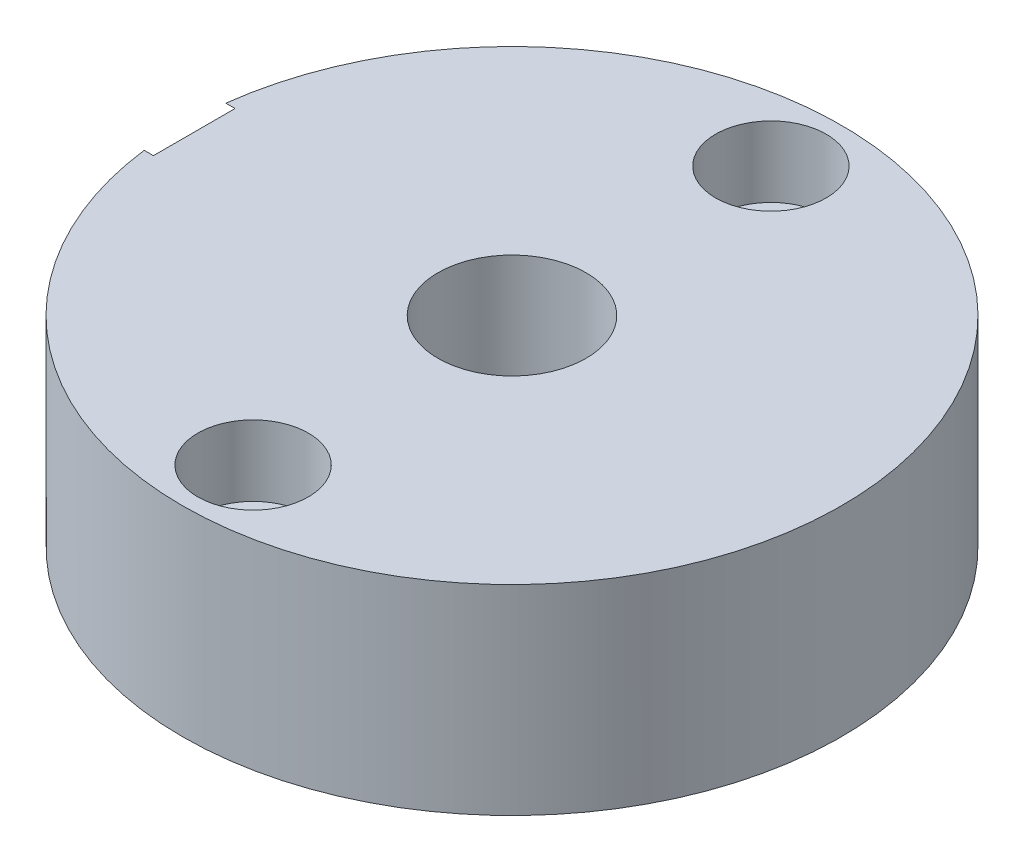
ISO-10303-21;
HEADER;
FILE_DESCRIPTION(('STEP AP214'),'2;1');
FILE_NAME('part.step','',(''),(''),'','','');
FILE_SCHEMA(('AUTOMOTIVE_DESIGN { 1 0 10303 214 1 1 1 1 }'));
ENDSEC;
DATA;
#1=APPLICATION_CONTEXT('core data for automotive mechanical design processes');
#2=APPLICATION_PROTOCOL_DEFINITION('international standard','automotive_design',2000,#1);
#3=PRODUCT_CONTEXT('',#1,'mechanical');
#4=PRODUCT('Part','Part','',(#3));
#5=PRODUCT_RELATED_PRODUCT_CATEGORY('part','',(#4));
#6=PRODUCT_DEFINITION_FORMATION('','',#4);
#7=PRODUCT_DEFINITION_CONTEXT('part definition',#1,'design');
#8=PRODUCT_DEFINITION('design','',#6,#7);
#9=PRODUCT_DEFINITION_SHAPE('','',#8);
#10=(LENGTH_UNIT() NAMED_UNIT(*) SI_UNIT(.MILLI.,.METRE.));
#11=(NAMED_UNIT(*) PLANE_ANGLE_UNIT() SI_UNIT($,.RADIAN.));
#12=(NAMED_UNIT(*) SI_UNIT($,.STERADIAN.) SOLID_ANGLE_UNIT());
#13=UNCERTAINTY_MEASURE_WITH_UNIT(LENGTH_MEASURE(1.E-05),#10,'distance_accuracy_value','');
#14=(GEOMETRIC_REPRESENTATION_CONTEXT(3) GLOBAL_UNCERTAINTY_ASSIGNED_CONTEXT((#13)) GLOBAL_UNIT_ASSIGNED_CONTEXT((#10,
#11,#12)) REPRESENTATION_CONTEXT('',''));
#15=CARTESIAN_POINT('',(0.,0.,0.));
#16=DIRECTION('',(0.,0.,1.));
#17=DIRECTION('',(1.,0.,0.));
#18=AXIS2_PLACEMENT_3D('',#15,#16,#17);
#19=CARTESIAN_POINT('',(0.,0.,0.));
#20=DIRECTION('',(0.,1.,0.));
#21=DIRECTION('',(0.,0.,1.));
#22=AXIS2_PLACEMENT_3D('',#19,#20,#21);
#23=CYLINDRICAL_SURFACE('',#22,14.224);
#24=CARTESIAN_POINT('',(-14.1144017031364,8.636,-1.76233951396999));
#25=CARTESIAN_POINT('',(-14.1018189708603,8.5860400774121,-1.86316944306617));
#26=CARTESIAN_POINT('',(-14.0884029510449,8.53182037336474,-1.96177374774942));
#27=CARTESIAN_POINT('',(-14.060309209815,8.41531440898184,-2.15389238319063));
#28=CARTESIAN_POINT('',(-14.0456316331366,8.35302907358731,-2.24740729584016));
#29=CARTESIAN_POINT('',(-14.0153964032384,8.22074490813978,-2.42885291939024));
#30=CARTESIAN_POINT('',(-13.9998376006231,8.15073588572585,-2.51677600419321));
#31=CARTESIAN_POINT('',(-13.9682944020645,8.00356223569752,-2.68632848078117));
#32=CARTESIAN_POINT('',(-13.9523100128641,7.92639772140656,-2.76795797220202));
#33=CARTESIAN_POINT('',(-13.9203573702186,7.76540029526525,-2.92441560607991));
#34=CARTESIAN_POINT('',(-13.9043891243674,7.68156506176776,-2.99924136100932));
#35=CARTESIAN_POINT('',(-13.8729273525824,7.50779999847033,-3.1415560905345));
#36=CARTESIAN_POINT('',(-13.8574338186305,7.41787027169462,-3.20904518910241));
#37=CARTESIAN_POINT('',(-13.8273998231862,7.23269940985755,-3.33608202397885));
#38=CARTESIAN_POINT('',(-13.8128574379487,7.1374697652673,-3.39564605863353));
#39=CARTESIAN_POINT('',(-13.7851236400461,6.94219371995553,-3.50653797394215));
#40=CARTESIAN_POINT('',(-13.7719315387029,6.84214981329113,-3.55787006074027));
#41=CARTESIAN_POINT('',(-13.7515217306795,6.67297933704027,-3.63577308768279));
#42=CARTESIAN_POINT('',(-13.7438077843705,6.60502971023918,-3.66479473624717));
#43=CARTESIAN_POINT('',(-13.7292386448564,6.46761208866137,-3.71899995238225));
#44=CARTESIAN_POINT('',(-13.7223825366595,6.39814580613028,-3.74418761569942));
#45=CARTESIAN_POINT('',(-13.716,6.3279809944466,-3.7674288314446));
#46=B_SPLINE_CURVE_WITH_KNOTS('',3,(#24,#25,#26,#27,#28,#29,#30,#31,#32,#33,#34,#35,#36,#37,#38,
#39,#40,#41,#42,#43,#44,#45),.UNSPECIFIED.,.F.,.F.,(4,2,2,2,2,2,2,2,2,2,4),(0.,
0.339571560025639,0.679104213490783,1.01909040632158,1.35907121561906,1.6991708722571,
2.0392647811214,2.37864808472907,2.71785742283711,2.94061439026513,3.1631316964547),.UNSPECIFIED.);
#47=CARTESIAN_POINT('',(-14.1144017031364,8.636,-1.76233951396999));
#48=VERTEX_POINT('',#47);
#49=CARTESIAN_POINT('',(-13.716,6.3279809944466,-3.7674288314446));
#50=VERTEX_POINT('',#49);
#51=EDGE_CURVE('E189',#48,#50,#46,.T.);
#52=ORIENTED_EDGE('',*,*,#51,.F.);
#53=CARTESIAN_POINT('',(0.,8.636,0.));
#54=DIRECTION('',(0.,1.,0.));
#55=DIRECTION('',(0.,0.,1.));
#56=AXIS2_PLACEMENT_3D('',#53,#54,#55);
#57=CIRCLE('',#56,14.224);
#58=CARTESIAN_POINT('',(-14.1144017031364,8.636,1.76233951396999));
#59=VERTEX_POINT('',#58);
#60=EDGE_CURVE('E158',#59,#48,#57,.T.);
#61=ORIENTED_EDGE('',*,*,#60,.F.);
#62=CARTESIAN_POINT('',(-13.716,6.32798099444662,3.7674288314446));
#63=CARTESIAN_POINT('',(-13.7256752274223,6.43441671403951,3.73218226606413));
#64=CARTESIAN_POINT('',(-13.7364511952819,6.5392480193785,3.69244070180806));
#65=CARTESIAN_POINT('',(-13.7598334716294,6.74499152616562,3.60434170694817));
#66=CARTESIAN_POINT('',(-13.7724394284483,6.84590447589213,3.55598593133243));
#67=CARTESIAN_POINT('',(-13.7991212477723,7.04319198204466,3.45099243760769));
#68=CARTESIAN_POINT('',(-13.8131978464105,7.1395642302546,3.39435056614256));
#69=CARTESIAN_POINT('',(-13.8423953365519,7.32706281981836,3.27324792969377));
#70=CARTESIAN_POINT('',(-13.8575162318728,7.41818914199239,3.2087871361258));
#71=CARTESIAN_POINT('',(-13.9037966552396,7.68277980250731,3.00434946030897));
#72=CARTESIAN_POINT('',(-13.9359009480219,7.8476460188197,2.85321568473428));
#73=CARTESIAN_POINT('',(-13.9989711835599,8.14950079732574,2.525596782463));
#74=CARTESIAN_POINT('',(-14.0299392423452,8.28654358683355,2.34916213506834));
#75=CARTESIAN_POINT('',(-14.0685657406809,8.44971584425602,2.09807351538581));
#76=CARTESIAN_POINT('',(-14.0782051283558,8.489695649873,2.03245392920464));
#77=CARTESIAN_POINT('',(-14.0968231765953,8.56576823735887,1.89901959457042));
#78=CARTESIAN_POINT('',(-14.1058026527453,8.6018658437257,1.83120771016513));
#79=CARTESIAN_POINT('',(-14.1144017031364,8.636,1.76233951396999));
#80=B_SPLINE_CURVE_WITH_KNOTS('',3,(#62,#63,#64,#65,#66,#67,#68,#69,#70,#71,#72,#73,#74,#75,#76,
#77,#78,#79),.UNSPECIFIED.,.F.,.F.,(4,2,2,2,2,2,2,2,4),(0.,0.337481169142765,0.674897570182395,
1.01248368238958,1.35007102877738,2.02460201647477,2.69780546224259,2.93003018694968,
3.16196290219643),.UNSPECIFIED.);
#81=CARTESIAN_POINT('',(-13.716,6.32798099444662,3.7674288314446));
#82=VERTEX_POINT('',#81);
#83=EDGE_CURVE('E57',#82,#59,#80,.T.);
#84=ORIENTED_EDGE('',*,*,#83,.F.);
#85=DIRECTION('',(0.,1.,0.));
#86=VECTOR('',#85,1.);
#87=CARTESIAN_POINT('',(-13.716,0.,3.7674288314446));
#88=LINE('',#87,#86);
#89=CARTESIAN_POINT('',(-13.716,3.83201900555338,3.7674288314446));
#90=VERTEX_POINT('',#89);
#91=EDGE_CURVE('E170',#90,#82,#88,.T.);
#92=ORIENTED_EDGE('',*,*,#91,.F.);
#93=CARTESIAN_POINT('',(-13.716,3.8320190055534,-3.7674288314446));
#94=CARTESIAN_POINT('',(-13.7256832030554,3.72549547487357,-3.73215300898994));
#95=CARTESIAN_POINT('',(-13.7364689511062,3.62057917763459,-3.69237510692438));
#96=CARTESIAN_POINT('',(-13.7598730650016,3.41467658831599,-3.60419119044807));
#97=CARTESIAN_POINT('',(-13.7724910095912,3.3136893996123,-3.55578715876054));
#98=CARTESIAN_POINT('',(-13.7991770735619,3.11642010455883,-3.45076856800852));
#99=CARTESIAN_POINT('',(-13.8132435746677,3.0201329211109,-3.39416314307337));
#100=CARTESIAN_POINT('',(-13.8424190011879,2.83279443524339,-3.27314752117977));
#101=CARTESIAN_POINT('',(-13.8575279696299,2.74174334922734,-3.20873700198464));
#102=CARTESIAN_POINT('',(-13.9037657698442,2.4773975772599,-3.00448246486439));
#103=CARTESIAN_POINT('',(-13.9358393240575,2.31267237301909,-2.85348831252477));
#104=CARTESIAN_POINT('',(-13.9989028009506,2.01080298829319,-2.52599924707586));
#105=CARTESIAN_POINT('',(-14.0298926315931,1.87366114569923,-2.3495021745848));
#106=CARTESIAN_POINT('',(-14.0877428513713,1.62926520659395,-1.97337670408356));
#107=CARTESIAN_POINT('',(-14.1145538216584,1.52235814638346,-1.77351423734908));
#108=CARTESIAN_POINT('',(-14.1605904232901,1.34387846931438,-1.35776696177541));
#109=CARTESIAN_POINT('',(-14.1798170716613,1.27230111456323,-1.14188430579399));
#110=CARTESIAN_POINT('',(-14.208102650291,1.16829544419417,-0.706019846943991));
#111=CARTESIAN_POINT('',(-14.2174060804188,1.13492416082455,-0.486279224026567));
#112=CARTESIAN_POINT('',(-14.2256485600171,1.10531829732902,-0.0441420578764475));
#113=CARTESIAN_POINT('',(-14.2245897983837,1.10907587415198,0.178253914530367));
#114=CARTESIAN_POINT('',(-14.2124057676836,1.15295471256416,0.612960969777735));
#115=CARTESIAN_POINT('',(-14.2015564223421,1.19207929289632,0.82538155554918));
#116=CARTESIAN_POINT('',(-14.1713318873773,1.30397960109528,1.24051122348173));
#117=CARTESIAN_POINT('',(-14.1519563507052,1.37675669875519,1.44321990995869));
#118=CARTESIAN_POINT('',(-14.106443156029,1.55466493345507,1.83573826506913));
#119=CARTESIAN_POINT('',(-14.0802343895498,1.66013864329423,2.02538406035225));
#120=CARTESIAN_POINT('',(-14.0238597684823,1.90021661958655,2.38467213064943));
#121=CARTESIAN_POINT('',(-13.9936921490099,2.03483389593779,2.55430541951769));
#122=CARTESIAN_POINT('',(-13.9314568097912,2.33472831851489,2.87476374704252));
#123=CARTESIAN_POINT('',(-13.8993593677901,2.5008933223189,3.02475174150323));
#124=CARTESIAN_POINT('',(-13.8378375095089,2.85626447377719,3.29479043090516));
#125=CARTESIAN_POINT('',(-13.8084099104598,3.04544253989866,3.41487707798468));
#126=CARTESIAN_POINT('',(-13.769424925045,3.33796885526584,3.56759035447409));
#127=CARTESIAN_POINT('',(-13.7575244888069,3.43446277740652,3.61311219815207));
#128=CARTESIAN_POINT('',(-13.7354216533658,3.63081755973086,3.69623910831399));
#129=CARTESIAN_POINT('',(-13.7252167492199,3.73067318611975,3.73385587576031));
#130=CARTESIAN_POINT('',(-13.716,3.83201900555338,3.7674288314446));
#131=B_SPLINE_CURVE_WITH_KNOTS('',3,(#93,#94,#95,#96,#97,#98,#99,#100,#101,#102,#103,#104,#105,
#106,#107,#108,#109,#110,#111,#112,#113,#114,#115,#116,#117,#118,#119,#120,#121,#122,#123,#124,
#125,#126,#127,#128,#129,#130),.UNSPECIFIED.,.F.,.F.,(4,2,2,2,2,2,2,2,2,2,2,2,2,2,2,2,2,2,4),
(0.,0.337759039795798,0.67544054528462,1.01274881551404,1.35007101640854,2.02390968472731,
2.69780544174397,3.37914838855052,4.06039993897245,4.7244481709033,5.3883561331668,
6.0341184903109,6.6799071349001,7.33270466319959,7.98579420813523,8.6611203768652,
9.33563059739257,9.65738621520687,9.97866216791095),.UNSPECIFIED.);
#132=CARTESIAN_POINT('',(-13.716,3.8320190055534,-3.7674288314446));
#133=VERTEX_POINT('',#132);
#134=EDGE_CURVE('E164',#133,#90,#131,.T.);
#135=ORIENTED_EDGE('',*,*,#134,.F.);
#136=DIRECTION('',(0.,1.,0.));
#137=VECTOR('',#136,1.);
#138=CARTESIAN_POINT('',(-13.716,0.,-3.7674288314446));
#139=LINE('',#138,#137);
#140=EDGE_CURVE('E190',#50,#133,#139,.F.);
#141=ORIENTED_EDGE('',*,*,#140,.F.);
#142=EDGE_LOOP('',(#52,#61,#84,#92,#135,#141));
#143=FACE_BOUND('',#142,.T.);
#144=CARTESIAN_POINT('',(0.,0.,0.));
#145=DIRECTION('',(0.,1.,0.));
#146=DIRECTION('',(0.,0.,1.));
#147=AXIS2_PLACEMENT_3D('',#144,#145,#146);
#148=CIRCLE('',#147,14.224);
#149=CARTESIAN_POINT('',(0.,0.,14.224));
#150=VERTEX_POINT('',#149);
#151=EDGE_CURVE('E161',#150,#150,#148,.T.);
#152=ORIENTED_EDGE('',*,*,#151,.T.);
#153=EDGE_LOOP('',(#152));
#154=FACE_BOUND('',#153,.T.);
#155=ADVANCED_FACE('F34',(#143,#154),#23,.T.);
#156=CARTESIAN_POINT('',(14.224,0.,0.));
#157=DIRECTION('',(0.,-1.,0.));
#158=DIRECTION('',(0.,0.,-1.));
#159=AXIS2_PLACEMENT_3D('',#156,#157,#158);
#160=PLANE('',#159);
#161=CARTESIAN_POINT('',(0.,0.,0.));
#162=DIRECTION('',(0.,-1.,0.));
#163=DIRECTION('',(0.,0.,-1.));
#164=AXIS2_PLACEMENT_3D('',#161,#162,#163);
#165=CIRCLE('',#164,7.74699999999999);
#166=CARTESIAN_POINT('',(0.,0.,-7.74699999999999));
#167=VERTEX_POINT('',#166);
#168=EDGE_CURVE('E98',#167,#167,#165,.T.);
#169=ORIENTED_EDGE('',*,*,#168,.F.);
#170=EDGE_LOOP('',(#169));
#171=FACE_BOUND('',#170,.T.);
#172=CARTESIAN_POINT('',(7.90262538654086,0.,-7.90262538654086));
#173=DIRECTION('',(0.,-1.,0.));
#174=DIRECTION('',(0.,0.,-1.));
#175=AXIS2_PLACEMENT_3D('',#172,#173,#174);
#176=CIRCLE('',#175,1.52399999999999);
#177=CARTESIAN_POINT('',(7.90262538654086,0.,-9.42662538654085));
#178=VERTEX_POINT('',#177);
#179=EDGE_CURVE('E110',#178,#178,#176,.T.);
#180=ORIENTED_EDGE('',*,*,#179,.F.);
#181=EDGE_LOOP('',(#180));
#182=FACE_BOUND('',#181,.T.);
#183=CARTESIAN_POINT('',(-7.90262538654086,0.,7.90262538654086));
#184=DIRECTION('',(0.,-1.,0.));
#185=DIRECTION('',(0.,0.,-1.));
#186=AXIS2_PLACEMENT_3D('',#183,#184,#185);
#187=CIRCLE('',#186,1.52399999999999);
#188=CARTESIAN_POINT('',(-7.90262538654086,0.,6.37862538654087));
#189=VERTEX_POINT('',#188);
#190=EDGE_CURVE('E116',#189,#189,#187,.T.);
#191=ORIENTED_EDGE('',*,*,#190,.F.);
#192=EDGE_LOOP('',(#191));
#193=FACE_BOUND('',#192,.T.);
#194=CARTESIAN_POINT('',(7.90262538654086,0.,7.90262538654086));
#195=DIRECTION('',(0.,-1.,0.));
#196=DIRECTION('',(0.,0.,-1.));
#197=AXIS2_PLACEMENT_3D('',#194,#195,#196);
#198=CIRCLE('',#197,1.52399999999999);
#199=CARTESIAN_POINT('',(7.90262538654086,0.,6.37862538654087));
#200=VERTEX_POINT('',#199);
#201=EDGE_CURVE('E122',#200,#200,#198,.T.);
#202=ORIENTED_EDGE('',*,*,#201,.F.);
#203=EDGE_LOOP('',(#202));
#204=FACE_BOUND('',#203,.T.);
#205=CARTESIAN_POINT('',(-7.90262538654086,0.,-7.90262538654086));
#206=DIRECTION('',(0.,-1.,0.));
#207=DIRECTION('',(0.,0.,-1.));
#208=AXIS2_PLACEMENT_3D('',#205,#206,#207);
#209=CIRCLE('',#208,1.52399999999999);
#210=CARTESIAN_POINT('',(-7.90262538654086,0.,-9.42662538654085));
#211=VERTEX_POINT('',#210);
#212=EDGE_CURVE('E128',#211,#211,#209,.T.);
#213=ORIENTED_EDGE('',*,*,#212,.F.);
#214=EDGE_LOOP('',(#213));
#215=FACE_BOUND('',#214,.T.);
#216=CARTESIAN_POINT('',(0.,0.,11.176));
#217=DIRECTION('',(0.,1.,0.));
#218=DIRECTION('',(0.,0.,1.));
#219=AXIS2_PLACEMENT_3D('',#216,#217,#218);
#220=CIRCLE('',#219,1.52400000000001);
#221=CARTESIAN_POINT('',(0.,0.,12.7));
#222=VERTEX_POINT('',#221);
#223=EDGE_CURVE('E143',#222,#222,#220,.T.);
#224=ORIENTED_EDGE('',*,*,#223,.T.);
#225=EDGE_LOOP('',(#224));
#226=FACE_BOUND('',#225,.T.);
#227=CARTESIAN_POINT('',(0.,0.,-11.176));
#228=DIRECTION('',(0.,1.,0.));
#229=DIRECTION('',(0.,0.,1.));
#230=AXIS2_PLACEMENT_3D('',#227,#228,#229);
#231=CIRCLE('',#230,1.52400000000001);
#232=CARTESIAN_POINT('',(0.,0.,-9.65199999999999));
#233=VERTEX_POINT('',#232);
#234=EDGE_CURVE('E155',#233,#233,#231,.T.);
#235=ORIENTED_EDGE('',*,*,#234,.T.);
#236=EDGE_LOOP('',(#235));
#237=FACE_BOUND('',#236,.T.);
#238=ORIENTED_EDGE('',*,*,#151,.F.);
#239=EDGE_LOOP('',(#238));
#240=FACE_BOUND('',#239,.T.);
#241=ADVANCED_FACE('F206',(#171,#182,#193,#204,#215,#226,#237,#240),#160,.T.);
#242=CARTESIAN_POINT('',(0.,8.636,0.));
#243=DIRECTION('',(0.,1.,0.));
#244=DIRECTION('',(0.,0.,1.));
#245=AXIS2_PLACEMENT_3D('',#242,#243,#244);
#246=PLANE('',#245);
#247=DIRECTION('',(-1.,0.,0.));
#248=VECTOR('',#247,1.);
#249=CARTESIAN_POINT('',(-14.224,8.636,-1.76233951396999));
#250=LINE('',#249,#248);
#251=CARTESIAN_POINT('',(-13.716,8.636,-1.76233951396999));
#252=VERTEX_POINT('',#251);
#253=EDGE_CURVE('E49',#252,#48,#250,.T.);
#254=ORIENTED_EDGE('',*,*,#253,.F.);
#255=DIRECTION('',(0.,0.,-1.));
#256=VECTOR('',#255,1.);
#257=CARTESIAN_POINT('',(-13.716,8.636,0.));
#258=LINE('',#257,#256);
#259=CARTESIAN_POINT('',(-13.716,8.636,1.76233951396999));
#260=VERTEX_POINT('',#259);
#261=EDGE_CURVE('E195',#260,#252,#258,.T.);
#262=ORIENTED_EDGE('',*,*,#261,.F.);
#263=DIRECTION('',(-1.,0.,0.));
#264=VECTOR('',#263,1.);
#265=CARTESIAN_POINT('',(-14.224,8.636,1.76233951396999));
#266=LINE('',#265,#264);
#267=EDGE_CURVE('E88',#59,#260,#266,.F.);
#268=ORIENTED_EDGE('',*,*,#267,.F.);
#269=ORIENTED_EDGE('',*,*,#60,.T.);
#270=EDGE_LOOP('',(#254,#262,#268,#269));
#271=FACE_BOUND('',#270,.T.);
#272=CARTESIAN_POINT('',(0.,8.636,0.));
#273=DIRECTION('',(0.,-1.,0.));
#274=DIRECTION('',(0.,0.,-1.));
#275=AXIS2_PLACEMENT_3D('',#272,#273,#274);
#276=CIRCLE('',#275,3.20040000000001);
#277=CARTESIAN_POINT('',(0.,8.636,-3.20040000000001));
#278=VERTEX_POINT('',#277);
#279=EDGE_CURVE('E107',#278,#278,#276,.T.);
#280=ORIENTED_EDGE('',*,*,#279,.T.);
#281=EDGE_LOOP('',(#280));
#282=FACE_BOUND('',#281,.T.);
#283=CARTESIAN_POINT('',(0.,8.636,11.176));
#284=DIRECTION('',(0.,1.,0.));
#285=DIRECTION('',(0.,0.,1.));
#286=AXIS2_PLACEMENT_3D('',#283,#284,#285);
#287=CIRCLE('',#286,2.38759999999999);
#288=CARTESIAN_POINT('',(0.,8.636,13.5636));
#289=VERTEX_POINT('',#288);
#290=EDGE_CURVE('E134',#289,#289,#287,.T.);
#291=ORIENTED_EDGE('',*,*,#290,.F.);
#292=EDGE_LOOP('',(#291));
#293=FACE_BOUND('',#292,.T.);
#294=CARTESIAN_POINT('',(0.,8.636,-11.176));
#295=DIRECTION('',(0.,1.,0.));
#296=DIRECTION('',(0.,0.,1.));
#297=AXIS2_PLACEMENT_3D('',#294,#295,#296);
#298=CIRCLE('',#297,2.38759999999999);
#299=CARTESIAN_POINT('',(0.,8.636,-8.78840000000001));
#300=VERTEX_POINT('',#299);
#301=EDGE_CURVE('E146',#300,#300,#298,.T.);
#302=ORIENTED_EDGE('',*,*,#301,.F.);
#303=EDGE_LOOP('',(#302));
#304=FACE_BOUND('',#303,.T.);
#305=ADVANCED_FACE('F211',(#271,#282,#293,#304),#246,.T.);
#306=CARTESIAN_POINT('',(0.,8.636,-11.176));
#307=DIRECTION('',(0.,1.,0.));
#308=DIRECTION('',(0.,0.,1.));
#309=AXIS2_PLACEMENT_3D('',#306,#307,#308);
#310=CYLINDRICAL_SURFACE('',#309,1.52400000000001);
#311=ORIENTED_EDGE('',*,*,#234,.F.);
#312=EDGE_LOOP('',(#311));
#313=FACE_BOUND('',#312,.T.);
#314=CARTESIAN_POINT('',(0.,5.588,-11.176));
#315=DIRECTION('',(0.,1.,0.));
#316=DIRECTION('',(0.,0.,1.));
#317=AXIS2_PLACEMENT_3D('',#314,#315,#316);
#318=CIRCLE('',#317,1.52400000000001);
#319=CARTESIAN_POINT('',(0.,5.588,-9.65199999999999));
#320=VERTEX_POINT('',#319);
#321=EDGE_CURVE('E152',#320,#320,#318,.T.);
#322=ORIENTED_EDGE('',*,*,#321,.T.);
#323=EDGE_LOOP('',(#322));
#324=FACE_BOUND('',#323,.T.);
#325=ADVANCED_FACE('F299',(#313,#324),#310,.F.);
#326=CARTESIAN_POINT('',(1.52400000000001,5.588,-11.176));
#327=DIRECTION('',(0.,-1.,0.));
#328=DIRECTION('',(0.,0.,-1.));
#329=AXIS2_PLACEMENT_3D('',#326,#327,#328);
#330=PLANE('',#329);
#331=ORIENTED_EDGE('',*,*,#321,.F.);
#332=EDGE_LOOP('',(#331));
#333=FACE_BOUND('',#332,.T.);
#334=CARTESIAN_POINT('',(0.,5.588,-11.176));
#335=DIRECTION('',(0.,1.,0.));
#336=DIRECTION('',(0.,0.,1.));
#337=AXIS2_PLACEMENT_3D('',#334,#335,#336);
#338=CIRCLE('',#337,2.38759999999999);
#339=CARTESIAN_POINT('',(0.,5.588,-8.78840000000001));
#340=VERTEX_POINT('',#339);
#341=EDGE_CURVE('E149',#340,#340,#338,.T.);
#342=ORIENTED_EDGE('',*,*,#341,.T.);
#343=EDGE_LOOP('',(#342));
#344=FACE_BOUND('',#343,.T.);
#345=ADVANCED_FACE('F295',(#333,#344),#330,.F.);
#346=CARTESIAN_POINT('',(0.,8.636,-11.176));
#347=DIRECTION('',(0.,1.,0.));
#348=DIRECTION('',(0.,0.,1.));
#349=AXIS2_PLACEMENT_3D('',#346,#347,#348);
#350=CYLINDRICAL_SURFACE('',#349,2.38759999999999);
#351=ORIENTED_EDGE('',*,*,#341,.F.);
#352=EDGE_LOOP('',(#351));
#353=FACE_BOUND('',#352,.T.);
#354=ORIENTED_EDGE('',*,*,#301,.T.);
#355=EDGE_LOOP('',(#354));
#356=FACE_BOUND('',#355,.T.);
#357=ADVANCED_FACE('F291',(#353,#356),#350,.F.);
#358=CARTESIAN_POINT('',(0.,8.636,11.176));
#359=DIRECTION('',(0.,1.,0.));
#360=DIRECTION('',(0.,0.,1.));
#361=AXIS2_PLACEMENT_3D('',#358,#359,#360);
#362=CYLINDRICAL_SURFACE('',#361,1.52400000000001);
#363=ORIENTED_EDGE('',*,*,#223,.F.);
#364=EDGE_LOOP('',(#363));
#365=FACE_BOUND('',#364,.T.);
#366=CARTESIAN_POINT('',(0.,5.588,11.176));
#367=DIRECTION('',(0.,1.,0.));
#368=DIRECTION('',(0.,0.,1.));
#369=AXIS2_PLACEMENT_3D('',#366,#367,#368);
#370=CIRCLE('',#369,1.52400000000001);
#371=CARTESIAN_POINT('',(0.,5.588,12.7));
#372=VERTEX_POINT('',#371);
#373=EDGE_CURVE('E140',#372,#372,#370,.T.);
#374=ORIENTED_EDGE('',*,*,#373,.T.);
#375=EDGE_LOOP('',(#374));
#376=FACE_BOUND('',#375,.T.);
#377=ADVANCED_FACE('F287',(#365,#376),#362,.F.);
#378=CARTESIAN_POINT('',(1.52400000000001,5.588,11.176));
#379=DIRECTION('',(0.,-1.,0.));
#380=DIRECTION('',(0.,0.,-1.));
#381=AXIS2_PLACEMENT_3D('',#378,#379,#380);
#382=PLANE('',#381);
#383=ORIENTED_EDGE('',*,*,#373,.F.);
#384=EDGE_LOOP('',(#383));
#385=FACE_BOUND('',#384,.T.);
#386=CARTESIAN_POINT('',(0.,5.588,11.176));
#387=DIRECTION('',(0.,1.,0.));
#388=DIRECTION('',(0.,0.,1.));
#389=AXIS2_PLACEMENT_3D('',#386,#387,#388);
#390=CIRCLE('',#389,2.38759999999999);
#391=CARTESIAN_POINT('',(0.,5.588,13.5636));
#392=VERTEX_POINT('',#391);
#393=EDGE_CURVE('E137',#392,#392,#390,.T.);
#394=ORIENTED_EDGE('',*,*,#393,.T.);
#395=EDGE_LOOP('',(#394));
#396=FACE_BOUND('',#395,.T.);
#397=ADVANCED_FACE('F283',(#385,#396),#382,.F.);
#398=CARTESIAN_POINT('',(0.,8.636,11.176));
#399=DIRECTION('',(0.,1.,0.));
#400=DIRECTION('',(0.,0.,1.));
#401=AXIS2_PLACEMENT_3D('',#398,#399,#400);
#402=CYLINDRICAL_SURFACE('',#401,2.38759999999999);
#403=ORIENTED_EDGE('',*,*,#393,.F.);
#404=EDGE_LOOP('',(#403));
#405=FACE_BOUND('',#404,.T.);
#406=ORIENTED_EDGE('',*,*,#290,.T.);
#407=EDGE_LOOP('',(#406));
#408=FACE_BOUND('',#407,.T.);
#409=ADVANCED_FACE('F279',(#405,#408),#402,.F.);
#410=CARTESIAN_POINT('',(-7.90262538654086,2.54,-7.90262538654086));
#411=DIRECTION('',(0.,1.,0.));
#412=DIRECTION('',(0.,0.,1.));
#413=AXIS2_PLACEMENT_3D('',#410,#411,#412);
#414=PLANE('',#413);
#415=CARTESIAN_POINT('',(-7.90262538654086,2.54,-7.90262538654086));
#416=DIRECTION('',(0.,-1.,0.));
#417=DIRECTION('',(0.,0.,-1.));
#418=AXIS2_PLACEMENT_3D('',#415,#416,#417);
#419=CIRCLE('',#418,1.52399999999999);
#420=CARTESIAN_POINT('',(-7.90262538654086,2.54,-9.42662538654084));
#421=VERTEX_POINT('',#420);
#422=EDGE_CURVE('E131',#421,#421,#419,.T.);
#423=ORIENTED_EDGE('',*,*,#422,.T.);
#424=EDGE_LOOP('',(#423));
#425=FACE_BOUND('',#424,.T.);
#426=ADVANCED_FACE('F275',(#425),#414,.F.);
#427=CARTESIAN_POINT('',(-7.90262538654086,0.,-7.90262538654086));
#428=DIRECTION('',(0.,-1.,0.));
#429=DIRECTION('',(0.,0.,-1.));
#430=AXIS2_PLACEMENT_3D('',#427,#428,#429);
#431=CYLINDRICAL_SURFACE('',#430,1.52399999999999);
#432=ORIENTED_EDGE('',*,*,#422,.F.);
#433=EDGE_LOOP('',(#432));
#434=FACE_BOUND('',#433,.T.);
#435=ORIENTED_EDGE('',*,*,#212,.T.);
#436=EDGE_LOOP('',(#435));
#437=FACE_BOUND('',#436,.T.);
#438=ADVANCED_FACE('F271',(#434,#437),#431,.F.);
#439=CARTESIAN_POINT('',(7.90262538654086,2.54,7.90262538654086));
#440=DIRECTION('',(0.,1.,0.));
#441=DIRECTION('',(0.,0.,1.));
#442=AXIS2_PLACEMENT_3D('',#439,#440,#441);
#443=PLANE('',#442);
#444=CARTESIAN_POINT('',(7.90262538654086,2.54,7.90262538654086));
#445=DIRECTION('',(0.,-1.,0.));
#446=DIRECTION('',(0.,0.,-1.));
#447=AXIS2_PLACEMENT_3D('',#444,#445,#446);
#448=CIRCLE('',#447,1.52399999999999);
#449=CARTESIAN_POINT('',(7.90262538654086,2.54,6.37862538654087));
#450=VERTEX_POINT('',#449);
#451=EDGE_CURVE('E125',#450,#450,#448,.T.);
#452=ORIENTED_EDGE('',*,*,#451,.T.);
#453=EDGE_LOOP('',(#452));
#454=FACE_BOUND('',#453,.T.);
#455=ADVANCED_FACE('F267',(#454),#443,.F.);
#456=CARTESIAN_POINT('',(7.90262538654086,0.,7.90262538654086));
#457=DIRECTION('',(0.,-1.,0.));
#458=DIRECTION('',(0.,0.,-1.));
#459=AXIS2_PLACEMENT_3D('',#456,#457,#458);
#460=CYLINDRICAL_SURFACE('',#459,1.52399999999999);
#461=ORIENTED_EDGE('',*,*,#451,.F.);
#462=EDGE_LOOP('',(#461));
#463=FACE_BOUND('',#462,.T.);
#464=ORIENTED_EDGE('',*,*,#201,.T.);
#465=EDGE_LOOP('',(#464));
#466=FACE_BOUND('',#465,.T.);
#467=ADVANCED_FACE('F263',(#463,#466),#460,.F.);
#468=CARTESIAN_POINT('',(-7.90262538654086,2.54,7.90262538654086));
#469=DIRECTION('',(0.,1.,0.));
#470=DIRECTION('',(0.,0.,1.));
#471=AXIS2_PLACEMENT_3D('',#468,#469,#470);
#472=PLANE('',#471);
#473=CARTESIAN_POINT('',(-7.90262538654086,2.54,7.90262538654086));
#474=DIRECTION('',(0.,-1.,0.));
#475=DIRECTION('',(0.,0.,-1.));
#476=AXIS2_PLACEMENT_3D('',#473,#474,#475);
#477=CIRCLE('',#476,1.52399999999999);
#478=CARTESIAN_POINT('',(-7.90262538654086,2.54,6.37862538654087));
#479=VERTEX_POINT('',#478);
#480=EDGE_CURVE('E119',#479,#479,#477,.T.);
#481=ORIENTED_EDGE('',*,*,#480,.T.);
#482=EDGE_LOOP('',(#481));
#483=FACE_BOUND('',#482,.T.);
#484=ADVANCED_FACE('F259',(#483),#472,.F.);
#485=CARTESIAN_POINT('',(-7.90262538654086,0.,7.90262538654086));
#486=DIRECTION('',(0.,-1.,0.));
#487=DIRECTION('',(0.,0.,-1.));
#488=AXIS2_PLACEMENT_3D('',#485,#486,#487);
#489=CYLINDRICAL_SURFACE('',#488,1.52399999999999);
#490=ORIENTED_EDGE('',*,*,#480,.F.);
#491=EDGE_LOOP('',(#490));
#492=FACE_BOUND('',#491,.T.);
#493=ORIENTED_EDGE('',*,*,#190,.T.);
#494=EDGE_LOOP('',(#493));
#495=FACE_BOUND('',#494,.T.);
#496=ADVANCED_FACE('F255',(#492,#495),#489,.F.);
#497=CARTESIAN_POINT('',(7.90262538654086,2.54,-7.90262538654086));
#498=DIRECTION('',(0.,1.,0.));
#499=DIRECTION('',(0.,0.,1.));
#500=AXIS2_PLACEMENT_3D('',#497,#498,#499);
#501=PLANE('',#500);
#502=CARTESIAN_POINT('',(7.90262538654086,2.54,-7.90262538654086));
#503=DIRECTION('',(0.,-1.,0.));
#504=DIRECTION('',(0.,0.,-1.));
#505=AXIS2_PLACEMENT_3D('',#502,#503,#504);
#506=CIRCLE('',#505,1.52399999999999);
#507=CARTESIAN_POINT('',(7.90262538654086,2.54,-9.42662538654084));
#508=VERTEX_POINT('',#507);
#509=EDGE_CURVE('E113',#508,#508,#506,.T.);
#510=ORIENTED_EDGE('',*,*,#509,.T.);
#511=EDGE_LOOP('',(#510));
#512=FACE_BOUND('',#511,.T.);
#513=ADVANCED_FACE('F251',(#512),#501,.F.);
#514=CARTESIAN_POINT('',(7.90262538654086,0.,-7.90262538654086));
#515=DIRECTION('',(0.,-1.,0.));
#516=DIRECTION('',(0.,0.,-1.));
#517=AXIS2_PLACEMENT_3D('',#514,#515,#516);
#518=CYLINDRICAL_SURFACE('',#517,1.52399999999999);
#519=ORIENTED_EDGE('',*,*,#509,.F.);
#520=EDGE_LOOP('',(#519));
#521=FACE_BOUND('',#520,.T.);
#522=ORIENTED_EDGE('',*,*,#179,.T.);
#523=EDGE_LOOP('',(#522));
#524=FACE_BOUND('',#523,.T.);
#525=ADVANCED_FACE('F247',(#521,#524),#518,.F.);
#526=CARTESIAN_POINT('',(0.,0.,0.));
#527=DIRECTION('',(0.,-1.,0.));
#528=DIRECTION('',(0.,0.,-1.));
#529=AXIS2_PLACEMENT_3D('',#526,#527,#528);
#530=CYLINDRICAL_SURFACE('',#529,3.20040000000001);
#531=ORIENTED_EDGE('',*,*,#279,.F.);
#532=EDGE_LOOP('',(#531));
#533=FACE_BOUND('',#532,.T.);
#534=CARTESIAN_POINT('',(0.,2.54,0.));
#535=DIRECTION('',(0.,-1.,0.));
#536=DIRECTION('',(0.,0.,-1.));
#537=AXIS2_PLACEMENT_3D('',#534,#535,#536);
#538=CIRCLE('',#537,3.20040000000001);
#539=CARTESIAN_POINT('',(0.,2.54,-3.20040000000001));
#540=VERTEX_POINT('',#539);
#541=EDGE_CURVE('E104',#540,#540,#538,.T.);
#542=ORIENTED_EDGE('',*,*,#541,.T.);
#543=EDGE_LOOP('',(#542));
#544=FACE_BOUND('',#543,.T.);
#545=ADVANCED_FACE('F239',(#533,#544),#530,.F.);
#546=CARTESIAN_POINT('',(3.20040000000001,2.54,0.));
#547=DIRECTION('',(0.,1.,0.));
#548=DIRECTION('',(0.,0.,1.));
#549=AXIS2_PLACEMENT_3D('',#546,#547,#548);
#550=PLANE('',#549);
#551=ORIENTED_EDGE('',*,*,#541,.F.);
#552=EDGE_LOOP('',(#551));
#553=FACE_BOUND('',#552,.T.);
#554=CARTESIAN_POINT('',(0.,2.54,0.));
#555=DIRECTION('',(0.,-1.,0.));
#556=DIRECTION('',(0.,0.,-1.));
#557=AXIS2_PLACEMENT_3D('',#554,#555,#556);
#558=CIRCLE('',#557,7.747);
#559=CARTESIAN_POINT('',(0.,2.54,-7.747));
#560=VERTEX_POINT('',#559);
#561=EDGE_CURVE('E101',#560,#560,#558,.T.);
#562=ORIENTED_EDGE('',*,*,#561,.T.);
#563=EDGE_LOOP('',(#562));
#564=FACE_BOUND('',#563,.T.);
#565=ADVANCED_FACE('F233',(#553,#564),#550,.F.);
#566=CARTESIAN_POINT('',(0.,0.,0.));
#567=DIRECTION('',(0.,-1.,0.));
#568=DIRECTION('',(0.,0.,-1.));
#569=AXIS2_PLACEMENT_3D('',#566,#567,#568);
#570=CYLINDRICAL_SURFACE('',#569,7.747);
#571=ORIENTED_EDGE('',*,*,#561,.F.);
#572=EDGE_LOOP('',(#571));
#573=FACE_BOUND('',#572,.T.);
#574=ORIENTED_EDGE('',*,*,#168,.T.);
#575=EDGE_LOOP('',(#574));
#576=FACE_BOUND('',#575,.T.);
#577=ADVANCED_FACE('F228',(#573,#576),#570,.F.);
#578=CARTESIAN_POINT('',(-14.224,5.08,0.));
#579=DIRECTION('',(-1.,0.,0.));
#580=DIRECTION('',(0.,0.,1.));
#581=AXIS2_PLACEMENT_3D('',#578,#579,#580);
#582=CYLINDRICAL_SURFACE('',#581,3.96875);
#583=ORIENTED_EDGE('',*,*,#253,.T.);
#584=ORIENTED_EDGE('',*,*,#51,.T.);
#585=CARTESIAN_POINT('',(-13.716,5.08,0.));
#586=DIRECTION('',(-1.,0.,0.));
#587=DIRECTION('',(0.,0.,1.));
#588=AXIS2_PLACEMENT_3D('',#585,#586,#587);
#589=CIRCLE('',#588,3.96875);
#590=EDGE_CURVE('E93',#252,#50,#589,.T.);
#591=ORIENTED_EDGE('',*,*,#590,.F.);
#592=EDGE_LOOP('',(#583,#584,#591));
#593=FACE_BOUND('',#592,.T.);
#594=ADVANCED_FACE('F180',(#593),#582,.F.);
#595=ORIENTED_EDGE('',*,*,#267,.T.);
#596=EDGE_CURVE('E89',#82,#260,#589,.T.);
#597=ORIENTED_EDGE('',*,*,#596,.F.);
#598=ORIENTED_EDGE('',*,*,#83,.T.);
#599=EDGE_LOOP('',(#595,#597,#598));
#600=FACE_BOUND('',#599,.T.);
#601=ADVANCED_FACE('F82',(#600),#582,.F.);
#602=CARTESIAN_POINT('',(-7.11200000000001,5.08,0.));
#603=DIRECTION('',(-1.,0.,0.));
#604=DIRECTION('',(0.,0.,1.));
#605=AXIS2_PLACEMENT_3D('',#602,#603,#604);
#606=CONICAL_SURFACE('',#605,1.98374,1.04719755107321);
#607=CARTESIAN_POINT('',(-5.96668717667142,5.08,0.));
#608=VERTEX_POINT('',#607);
#609=VERTEX_LOOP('',#608);
#610=FACE_BOUND('',#609,.T.);
#611=CARTESIAN_POINT('',(-7.11200000000001,5.08,0.));
#612=DIRECTION('',(-1.,0.,0.));
#613=DIRECTION('',(0.,0.,1.));
#614=AXIS2_PLACEMENT_3D('',#611,#612,#613);
#615=CIRCLE('',#614,1.98374);
#616=CARTESIAN_POINT('',(-7.11200000000001,5.08,1.98374));
#617=VERTEX_POINT('',#616);
#618=EDGE_CURVE('E86',#617,#617,#615,.T.);
#619=ORIENTED_EDGE('',*,*,#618,.T.);
#620=EDGE_LOOP('',(#619));
#621=FACE_BOUND('',#620,.T.);
#622=ADVANCED_FACE('F78',(#610,#621),#606,.F.);
#623=CARTESIAN_POINT('',(-14.224,5.08,0.));
#624=DIRECTION('',(-1.,0.,0.));
#625=DIRECTION('',(0.,0.,1.));
#626=AXIS2_PLACEMENT_3D('',#623,#624,#625);
#627=CYLINDRICAL_SURFACE('',#626,1.98374);
#628=CARTESIAN_POINT('',(-13.2867400000242,5.08,0.));
#629=DIRECTION('',(1.,0.,0.));
#630=DIRECTION('',(0.,0.,-1.));
#631=AXIS2_PLACEMENT_3D('',#628,#629,#630);
#632=CIRCLE('',#631,1.98374);
#633=CARTESIAN_POINT('',(-13.2867400000242,5.08,-1.98374));
#634=VERTEX_POINT('',#633);
#635=EDGE_CURVE('E42',#634,#634,#632,.F.);
#636=ORIENTED_EDGE('',*,*,#635,.T.);
#637=EDGE_LOOP('',(#636));
#638=FACE_BOUND('',#637,.T.);
#639=ORIENTED_EDGE('',*,*,#618,.F.);
#640=EDGE_LOOP('',(#639));
#641=FACE_BOUND('',#640,.T.);
#642=ADVANCED_FACE('F81',(#638,#641),#627,.F.);
#643=CARTESIAN_POINT('',(-13.716,7.06374,0.));
#644=DIRECTION('',(1.,0.,0.));
#645=DIRECTION('',(0.,0.,-1.));
#646=AXIS2_PLACEMENT_3D('',#643,#644,#645);
#647=PLANE('',#646);
#648=CARTESIAN_POINT('',(-13.716,5.08,0.));
#649=DIRECTION('',(1.,0.,0.));
#650=DIRECTION('',(0.,0.,-1.));
#651=AXIS2_PLACEMENT_3D('',#648,#649,#650);
#652=CIRCLE('',#651,2.41299999997578);
#653=CARTESIAN_POINT('',(-13.716,5.08,-2.41299999997578));
#654=VERTEX_POINT('',#653);
#655=EDGE_CURVE('E11',#654,#654,#652,.T.);
#656=ORIENTED_EDGE('',*,*,#655,.T.);
#657=EDGE_LOOP('',(#656));
#658=FACE_BOUND('',#657,.T.);
#659=ORIENTED_EDGE('',*,*,#140,.T.);
#660=EDGE_CURVE('E95',#133,#90,#589,.T.);
#661=ORIENTED_EDGE('',*,*,#660,.T.);
#662=ORIENTED_EDGE('',*,*,#91,.T.);
#663=ORIENTED_EDGE('',*,*,#596,.T.);
#664=ORIENTED_EDGE('',*,*,#261,.T.);
#665=ORIENTED_EDGE('',*,*,#590,.T.);
#666=EDGE_LOOP('',(#659,#661,#662,#663,#664,#665));
#667=FACE_BOUND('',#666,.T.);
#668=ADVANCED_FACE('F178',(#658,#667),#647,.F.);
#669=ORIENTED_EDGE('',*,*,#660,.F.);
#670=ORIENTED_EDGE('',*,*,#134,.T.);
#671=EDGE_LOOP('',(#669,#670));
#672=FACE_BOUND('',#671,.T.);
#673=ADVANCED_FACE('F174',(#672),#582,.F.);
#674=CARTESIAN_POINT('',(-13.2867400000242,5.08,0.));
#675=DIRECTION('',(-1.,0.,0.));
#676=DIRECTION('',(0.,0.,1.));
#677=AXIS2_PLACEMENT_3D('',#674,#675,#676);
#678=CONICAL_SURFACE('',#677,1.98374,0.785398163397453);
#679=ORIENTED_EDGE('',*,*,#655,.F.);
#680=EDGE_LOOP('',(#679));
#681=FACE_BOUND('',#680,.T.);
#682=ORIENTED_EDGE('',*,*,#635,.F.);
#683=EDGE_LOOP('',(#682));
#684=FACE_BOUND('',#683,.T.);
#685=ADVANCED_FACE('F36',(#681,#684),#678,.F.);
#686=CLOSED_SHELL('',(#155,#241,#305,#325,#345,#357,#377,#397,#409,#426,#438,#455,#467,#484,
#496,#513,#525,#545,#565,#577,#594,#601,#622,#642,#668,#673,#685));
#687=MANIFOLD_SOLID_BREP('B2',#686);
#688=ADVANCED_BREP_SHAPE_REPRESENTATION('',(#18,#687),#14);
#689=SHAPE_DEFINITION_REPRESENTATION(#9,#688);
ENDSEC;
END-ISO-10303-21;
